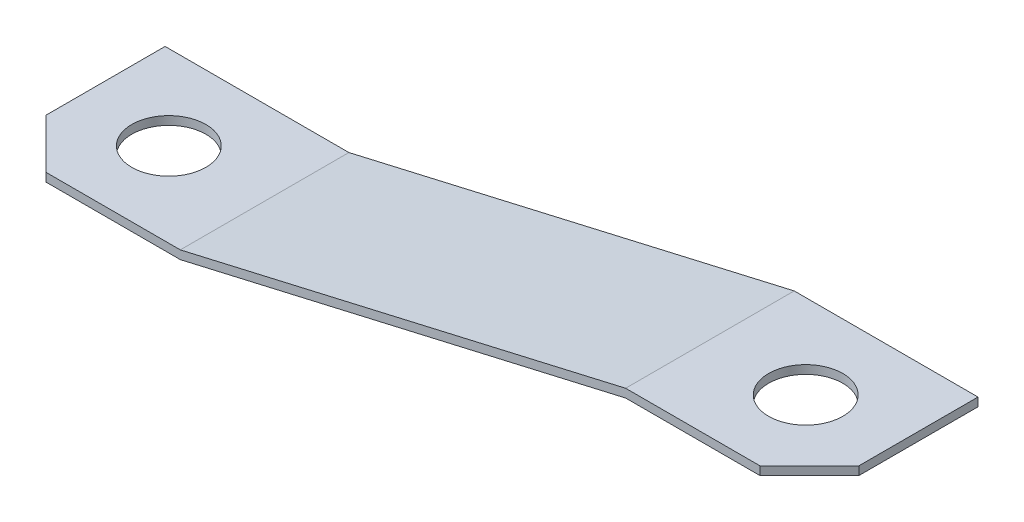
ISO-10303-21;
HEADER;
FILE_DESCRIPTION(('STEP AP214'),'2;1');
FILE_NAME('part.step','',(''),(''),'','','');
FILE_SCHEMA(('AUTOMOTIVE_DESIGN { 1 0 10303 214 1 1 1 1 }'));
ENDSEC;
DATA;
#1=APPLICATION_CONTEXT('core data for automotive mechanical design processes');
#2=APPLICATION_PROTOCOL_DEFINITION('international standard','automotive_design',2000,#1);
#3=PRODUCT_CONTEXT('',#1,'mechanical');
#4=PRODUCT('Part','Part','',(#3));
#5=PRODUCT_RELATED_PRODUCT_CATEGORY('part','',(#4));
#6=PRODUCT_DEFINITION_FORMATION('','',#4);
#7=PRODUCT_DEFINITION_CONTEXT('part definition',#1,'design');
#8=PRODUCT_DEFINITION('design','',#6,#7);
#9=PRODUCT_DEFINITION_SHAPE('','',#8);
#10=(LENGTH_UNIT() NAMED_UNIT(*) SI_UNIT(.MILLI.,.METRE.));
#11=(NAMED_UNIT(*) PLANE_ANGLE_UNIT() SI_UNIT($,.RADIAN.));
#12=(NAMED_UNIT(*) SI_UNIT($,.STERADIAN.) SOLID_ANGLE_UNIT());
#13=UNCERTAINTY_MEASURE_WITH_UNIT(LENGTH_MEASURE(1.E-05),#10,'distance_accuracy_value','');
#14=(GEOMETRIC_REPRESENTATION_CONTEXT(3) GLOBAL_UNCERTAINTY_ASSIGNED_CONTEXT((#13)) GLOBAL_UNIT_ASSIGNED_CONTEXT((#10,
#11,#12)) REPRESENTATION_CONTEXT('',''));
#15=CARTESIAN_POINT('',(0.,0.,0.));
#16=DIRECTION('',(0.,0.,1.));
#17=DIRECTION('',(1.,0.,0.));
#18=AXIS2_PLACEMENT_3D('',#15,#16,#17);
#19=CARTESIAN_POINT('',(-57.3648701182666,-1.2,23.85));
#20=DIRECTION('',(1.,0.,0.));
#21=DIRECTION('',(0.,0.,-1.));
#22=AXIS2_PLACEMENT_3D('',#19,#20,#21);
#23=PLANE('',#22);
#24=DIRECTION('',(0.,0.,-1.));
#25=VECTOR('',#24,1.);
#26=CARTESIAN_POINT('',(-57.3648701182666,-1.2,23.85));
#27=LINE('',#26,#25);
#28=CARTESIAN_POINT('',(-57.3648701182666,-1.2,16.85));
#29=VERTEX_POINT('',#28);
#30=CARTESIAN_POINT('',(-57.3648701182666,-1.2,0.));
#31=VERTEX_POINT('',#30);
#32=EDGE_CURVE('E129',#29,#31,#27,.T.);
#33=ORIENTED_EDGE('',*,*,#32,.F.);
#34=DIRECTION('',(0.,1.,0.));
#35=VECTOR('',#34,1.);
#36=CARTESIAN_POINT('',(-57.3648701182666,-1.2,16.85));
#37=LINE('',#36,#35);
#38=CARTESIAN_POINT('',(-57.3648701182666,0.,16.85));
#39=VERTEX_POINT('',#38);
#40=EDGE_CURVE('E184',#29,#39,#37,.T.);
#41=ORIENTED_EDGE('',*,*,#40,.T.);
#42=DIRECTION('',(0.,0.,-1.));
#43=VECTOR('',#42,1.);
#44=CARTESIAN_POINT('',(-57.3648701182666,0.,23.85));
#45=LINE('',#44,#43);
#46=CARTESIAN_POINT('',(-57.3648701182666,0.,0.));
#47=VERTEX_POINT('',#46);
#48=EDGE_CURVE('E146',#39,#47,#45,.T.);
#49=ORIENTED_EDGE('',*,*,#48,.T.);
#50=DIRECTION('',(0.,-1.,0.));
#51=VECTOR('',#50,1.);
#52=CARTESIAN_POINT('',(-57.3648701182666,-1.2,0.));
#53=LINE('',#52,#51);
#54=EDGE_CURVE('E147',#47,#31,#53,.T.);
#55=ORIENTED_EDGE('',*,*,#54,.T.);
#56=EDGE_LOOP('',(#33,#41,#49,#55));
#57=FACE_BOUND('',#56,.T.);
#58=ADVANCED_FACE('F33',(#57),#23,.F.);
#59=CARTESIAN_POINT('',(-31.3648701182666,-1.2,23.85));
#60=DIRECTION('',(0.,1.,0.));
#61=DIRECTION('',(-1.,0.,0.));
#62=AXIS2_PLACEMENT_3D('',#59,#60,#61);
#63=PLANE('',#62);
#64=CARTESIAN_POINT('',(-44.9148701182666,-1.2,11.925));
#65=DIRECTION('',(0.,1.,0.));
#66=DIRECTION('',(0.,0.,1.));
#67=AXIS2_PLACEMENT_3D('',#64,#65,#66);
#68=CIRCLE('',#67,5.25);
#69=CARTESIAN_POINT('',(-44.9148701182666,-1.2,17.175));
#70=VERTEX_POINT('',#69);
#71=EDGE_CURVE('E264',#70,#70,#68,.T.);
#72=ORIENTED_EDGE('',*,*,#71,.T.);
#73=EDGE_LOOP('',(#72));
#74=FACE_BOUND('',#73,.T.);
#75=DIRECTION('',(1.,0.,0.));
#76=VECTOR('',#75,1.);
#77=CARTESIAN_POINT('',(-31.3648701182666,-1.2,23.85));
#78=LINE('',#77,#76);
#79=CARTESIAN_POINT('',(-50.3648701182666,-1.2,23.85));
#80=VERTEX_POINT('',#79);
#81=CARTESIAN_POINT('',(-31.3648701182666,-1.2,23.85));
#82=VERTEX_POINT('',#81);
#83=EDGE_CURVE('E109',#80,#82,#78,.T.);
#84=ORIENTED_EDGE('',*,*,#83,.F.);
#85=DIRECTION('',(0.707106781186545,0.,0.70710678118655));
#86=VECTOR('',#85,1.);
#87=CARTESIAN_POINT('',(-50.3648701182666,-1.2,23.85));
#88=LINE('',#87,#86);
#89=EDGE_CURVE('E182',#80,#29,#88,.F.);
#90=ORIENTED_EDGE('',*,*,#89,.T.);
#91=ORIENTED_EDGE('',*,*,#32,.T.);
#92=DIRECTION('',(1.,0.,0.));
#93=VECTOR('',#92,1.);
#94=CARTESIAN_POINT('',(-31.3648701182666,-1.2,0.));
#95=LINE('',#94,#93);
#96=CARTESIAN_POINT('',(-31.3648701182666,-1.2,0.));
#97=VERTEX_POINT('',#96);
#98=EDGE_CURVE('E126',#31,#97,#95,.T.);
#99=ORIENTED_EDGE('',*,*,#98,.T.);
#100=DIRECTION('',(0.,0.,-1.));
#101=VECTOR('',#100,1.);
#102=CARTESIAN_POINT('',(-31.3648701182666,-1.2,23.85));
#103=LINE('',#102,#101);
#104=EDGE_CURVE('E123',#82,#97,#103,.T.);
#105=ORIENTED_EDGE('',*,*,#104,.F.);
#106=EDGE_LOOP('',(#84,#90,#91,#99,#105));
#107=FACE_BOUND('',#106,.T.);
#108=ADVANCED_FACE('F124',(#74,#107),#63,.F.);
#109=CARTESIAN_POINT('',(31.6351298817334,13.3446960409105,23.85));
#110=DIRECTION('',(-0.224951054343866,0.974370064785235,0.));
#111=DIRECTION('',(-0.974370064785235,-0.224951054343866,0.));
#112=AXIS2_PLACEMENT_3D('',#109,#110,#111);
#113=PLANE('',#112);
#114=DIRECTION('',(0.974370064785235,0.224951054343866,0.));
#115=VECTOR('',#114,1.);
#116=CARTESIAN_POINT('',(31.6351298817334,13.3446960409105,0.));
#117=LINE('',#116,#115);
#118=CARTESIAN_POINT('',(31.6351298817334,13.3446960409105,0.));
#119=VERTEX_POINT('',#118);
#120=EDGE_CURVE('E151',#97,#119,#117,.T.);
#121=ORIENTED_EDGE('',*,*,#120,.T.);
#122=DIRECTION('',(0.,0.,-1.));
#123=VECTOR('',#122,1.);
#124=CARTESIAN_POINT('',(31.6351298817334,13.3446960409105,23.85));
#125=LINE('',#124,#123);
#126=CARTESIAN_POINT('',(31.6351298817334,13.3446960409105,23.85));
#127=VERTEX_POINT('',#126);
#128=EDGE_CURVE('E130',#127,#119,#125,.T.);
#129=ORIENTED_EDGE('',*,*,#128,.F.);
#130=DIRECTION('',(0.974370064785235,0.224951054343866,0.));
#131=VECTOR('',#130,1.);
#132=CARTESIAN_POINT('',(31.6351298817334,13.3446960409105,23.85));
#133=LINE('',#132,#131);
#134=EDGE_CURVE('E115',#82,#127,#133,.T.);
#135=ORIENTED_EDGE('',*,*,#134,.F.);
#136=ORIENTED_EDGE('',*,*,#104,.T.);
#137=EDGE_LOOP('',(#121,#129,#135,#136));
#138=FACE_BOUND('',#137,.T.);
#139=ADVANCED_FACE('F132',(#138),#113,.F.);
#140=CARTESIAN_POINT('',(57.6351298817334,13.3446960409105,23.85));
#141=DIRECTION('',(0.,1.,0.));
#142=DIRECTION('',(-1.,0.,0.));
#143=AXIS2_PLACEMENT_3D('',#140,#141,#142);
#144=PLANE('',#143);
#145=CARTESIAN_POINT('',(45.1851298817334,13.3446960409105,11.925));
#146=DIRECTION('',(0.,1.,0.));
#147=DIRECTION('',(-1.,0.,0.));
#148=AXIS2_PLACEMENT_3D('',#145,#146,#147);
#149=CIRCLE('',#148,5.25);
#150=CARTESIAN_POINT('',(39.9351298817334,13.3446960409105,11.925));
#151=VERTEX_POINT('',#150);
#152=EDGE_CURVE('E263',#151,#151,#149,.T.);
#153=ORIENTED_EDGE('',*,*,#152,.T.);
#154=EDGE_LOOP('',(#153));
#155=FACE_BOUND('',#154,.T.);
#156=DIRECTION('',(0.,0.,-1.));
#157=VECTOR('',#156,1.);
#158=CARTESIAN_POINT('',(57.6351298817334,13.3446960409105,23.85));
#159=LINE('',#158,#157);
#160=CARTESIAN_POINT('',(57.6351298817334,13.3446960409105,16.85));
#161=VERTEX_POINT('',#160);
#162=CARTESIAN_POINT('',(57.6351298817334,13.3446960409105,0.));
#163=VERTEX_POINT('',#162);
#164=EDGE_CURVE('E174',#161,#163,#159,.T.);
#165=ORIENTED_EDGE('',*,*,#164,.F.);
#166=DIRECTION('',(0.707106781186546,0.,-0.707106781186549));
#167=VECTOR('',#166,1.);
#168=CARTESIAN_POINT('',(50.6351298817334,13.3446960409105,23.85));
#169=LINE('',#168,#167);
#170=CARTESIAN_POINT('',(50.6351298817334,13.3446960409105,23.85));
#171=VERTEX_POINT('',#170);
#172=EDGE_CURVE('E11',#161,#171,#169,.F.);
#173=ORIENTED_EDGE('',*,*,#172,.T.);
#174=DIRECTION('',(1.,0.,0.));
#175=VECTOR('',#174,1.);
#176=CARTESIAN_POINT('',(57.6351298817334,13.3446960409105,23.85));
#177=LINE('',#176,#175);
#178=EDGE_CURVE('E135',#127,#171,#177,.T.);
#179=ORIENTED_EDGE('',*,*,#178,.F.);
#180=ORIENTED_EDGE('',*,*,#128,.T.);
#181=DIRECTION('',(1.,0.,0.));
#182=VECTOR('',#181,1.);
#183=CARTESIAN_POINT('',(57.6351298817334,13.3446960409105,0.));
#184=LINE('',#183,#182);
#185=EDGE_CURVE('E153',#119,#163,#184,.T.);
#186=ORIENTED_EDGE('',*,*,#185,.T.);
#187=EDGE_LOOP('',(#165,#173,#179,#180,#186));
#188=FACE_BOUND('',#187,.T.);
#189=ADVANCED_FACE('F209',(#155,#188),#144,.F.);
#190=CARTESIAN_POINT('',(57.6351298817334,14.5446960409105,23.85));
#191=DIRECTION('',(-1.,0.,0.));
#192=DIRECTION('',(0.,-1.,0.));
#193=AXIS2_PLACEMENT_3D('',#190,#191,#192);
#194=PLANE('',#193);
#195=DIRECTION('',(0.,0.,-1.));
#196=VECTOR('',#195,1.);
#197=CARTESIAN_POINT('',(57.6351298817334,14.5446960409105,23.85));
#198=LINE('',#197,#196);
#199=CARTESIAN_POINT('',(57.6351298817334,14.5446960409105,16.85));
#200=VERTEX_POINT('',#199);
#201=CARTESIAN_POINT('',(57.6351298817334,14.5446960409105,0.));
#202=VERTEX_POINT('',#201);
#203=EDGE_CURVE('E172',#200,#202,#198,.T.);
#204=ORIENTED_EDGE('',*,*,#203,.F.);
#205=DIRECTION('',(0.,-1.,0.));
#206=VECTOR('',#205,1.);
#207=CARTESIAN_POINT('',(57.6351298817334,14.5446960409105,16.85));
#208=LINE('',#207,#206);
#209=EDGE_CURVE('E42',#200,#161,#208,.T.);
#210=ORIENTED_EDGE('',*,*,#209,.T.);
#211=ORIENTED_EDGE('',*,*,#164,.T.);
#212=DIRECTION('',(0.,1.,0.));
#213=VECTOR('',#212,1.);
#214=CARTESIAN_POINT('',(57.6351298817334,14.5446960409105,0.));
#215=LINE('',#214,#213);
#216=EDGE_CURVE('E156',#163,#202,#215,.T.);
#217=ORIENTED_EDGE('',*,*,#216,.T.);
#218=EDGE_LOOP('',(#204,#210,#211,#217));
#219=FACE_BOUND('',#218,.T.);
#220=ADVANCED_FACE('F234',(#219),#194,.F.);
#221=CARTESIAN_POINT('',(31.6351298817334,14.5446960409105,23.85));
#222=DIRECTION('',(0.,-1.,0.));
#223=DIRECTION('',(1.,0.,0.));
#224=AXIS2_PLACEMENT_3D('',#221,#222,#223);
#225=PLANE('',#224);
#226=CARTESIAN_POINT('',(45.1851298817334,14.5446960409105,11.925));
#227=DIRECTION('',(0.,1.,0.));
#228=DIRECTION('',(0.,0.,-1.));
#229=AXIS2_PLACEMENT_3D('',#226,#227,#228);
#230=CIRCLE('',#229,5.25);
#231=CARTESIAN_POINT('',(45.1851298817334,14.5446960409105,6.675));
#232=VERTEX_POINT('',#231);
#233=EDGE_CURVE('E260',#232,#232,#230,.T.);
#234=ORIENTED_EDGE('',*,*,#233,.F.);
#235=EDGE_LOOP('',(#234));
#236=FACE_BOUND('',#235,.T.);
#237=DIRECTION('',(-1.,0.,0.));
#238=VECTOR('',#237,1.);
#239=CARTESIAN_POINT('',(31.6351298817334,14.5446960409105,23.85));
#240=LINE('',#239,#238);
#241=CARTESIAN_POINT('',(50.6351298817334,14.5446960409105,23.85));
#242=VERTEX_POINT('',#241);
#243=CARTESIAN_POINT('',(31.6351298817334,14.5446960409105,23.85));
#244=VERTEX_POINT('',#243);
#245=EDGE_CURVE('E137',#242,#244,#240,.T.);
#246=ORIENTED_EDGE('',*,*,#245,.F.);
#247=DIRECTION('',(-0.707106781186546,0.,0.707106781186549));
#248=VECTOR('',#247,1.);
#249=CARTESIAN_POINT('',(50.6351298817334,14.5446960409105,23.85));
#250=LINE('',#249,#248);
#251=EDGE_CURVE('E56',#242,#200,#250,.F.);
#252=ORIENTED_EDGE('',*,*,#251,.T.);
#253=ORIENTED_EDGE('',*,*,#203,.T.);
#254=DIRECTION('',(-1.,0.,0.));
#255=VECTOR('',#254,1.);
#256=CARTESIAN_POINT('',(31.6351298817334,14.5446960409105,0.));
#257=LINE('',#256,#255);
#258=CARTESIAN_POINT('',(31.6351298817334,14.5446960409105,0.));
#259=VERTEX_POINT('',#258);
#260=EDGE_CURVE('E159',#202,#259,#257,.T.);
#261=ORIENTED_EDGE('',*,*,#260,.T.);
#262=DIRECTION('',(0.,0.,-1.));
#263=VECTOR('',#262,1.);
#264=CARTESIAN_POINT('',(31.6351298817334,14.5446960409105,23.85));
#265=LINE('',#264,#263);
#266=EDGE_CURVE('E169',#244,#259,#265,.T.);
#267=ORIENTED_EDGE('',*,*,#266,.F.);
#268=EDGE_LOOP('',(#246,#252,#253,#261,#267));
#269=FACE_BOUND('',#268,.T.);
#270=ADVANCED_FACE('F238',(#236,#269),#225,.F.);
#271=CARTESIAN_POINT('',(-31.3648701182666,0.,23.85));
#272=DIRECTION('',(0.224951054343865,-0.974370064785235,0.));
#273=DIRECTION('',(0.974370064785235,0.224951054343865,0.));
#274=AXIS2_PLACEMENT_3D('',#271,#272,#273);
#275=PLANE('',#274);
#276=DIRECTION('',(-0.974370064785235,-0.224951054343865,0.));
#277=VECTOR('',#276,1.);
#278=CARTESIAN_POINT('',(-31.3648701182666,0.,0.));
#279=LINE('',#278,#277);
#280=CARTESIAN_POINT('',(-31.3648701182666,0.,0.));
#281=VERTEX_POINT('',#280);
#282=EDGE_CURVE('E161',#259,#281,#279,.T.);
#283=ORIENTED_EDGE('',*,*,#282,.T.);
#284=DIRECTION('',(0.,0.,-1.));
#285=VECTOR('',#284,1.);
#286=CARTESIAN_POINT('',(-31.3648701182666,0.,23.85));
#287=LINE('',#286,#285);
#288=CARTESIAN_POINT('',(-31.3648701182666,0.,23.85));
#289=VERTEX_POINT('',#288);
#290=EDGE_CURVE('E166',#289,#281,#287,.T.);
#291=ORIENTED_EDGE('',*,*,#290,.F.);
#292=DIRECTION('',(-0.974370064785235,-0.224951054343865,0.));
#293=VECTOR('',#292,1.);
#294=CARTESIAN_POINT('',(-31.3648701182666,0.,23.85));
#295=LINE('',#294,#293);
#296=EDGE_CURVE('E142',#244,#289,#295,.T.);
#297=ORIENTED_EDGE('',*,*,#296,.F.);
#298=ORIENTED_EDGE('',*,*,#266,.T.);
#299=EDGE_LOOP('',(#283,#291,#297,#298));
#300=FACE_BOUND('',#299,.T.);
#301=ADVANCED_FACE('F241',(#300),#275,.F.);
#302=CARTESIAN_POINT('',(-57.3648701182666,0.,23.85));
#303=DIRECTION('',(0.,-1.,0.));
#304=DIRECTION('',(0.,0.,-1.));
#305=AXIS2_PLACEMENT_3D('',#302,#303,#304);
#306=PLANE('',#305);
#307=CARTESIAN_POINT('',(-44.9148701182666,0.,11.925));
#308=DIRECTION('',(0.,-1.,0.));
#309=DIRECTION('',(0.,0.,-1.));
#310=AXIS2_PLACEMENT_3D('',#307,#308,#309);
#311=CIRCLE('',#310,5.25);
#312=CARTESIAN_POINT('',(-44.9148701182666,0.,6.67500000000001));
#313=VERTEX_POINT('',#312);
#314=EDGE_CURVE('E37',#313,#313,#311,.T.);
#315=ORIENTED_EDGE('',*,*,#314,.T.);
#316=EDGE_LOOP('',(#315));
#317=FACE_BOUND('',#316,.T.);
#318=ORIENTED_EDGE('',*,*,#48,.F.);
#319=DIRECTION('',(-0.707106781186545,0.,-0.70710678118655));
#320=VECTOR('',#319,1.);
#321=CARTESIAN_POINT('',(-50.3648701182666,0.,23.85));
#322=LINE('',#321,#320);
#323=CARTESIAN_POINT('',(-50.3648701182666,0.,23.85));
#324=VERTEX_POINT('',#323);
#325=EDGE_CURVE('E186',#39,#324,#322,.F.);
#326=ORIENTED_EDGE('',*,*,#325,.T.);
#327=DIRECTION('',(-1.,0.,0.));
#328=VECTOR('',#327,1.);
#329=CARTESIAN_POINT('',(-57.3648701182666,0.,23.85));
#330=LINE('',#329,#328);
#331=EDGE_CURVE('E144',#289,#324,#330,.T.);
#332=ORIENTED_EDGE('',*,*,#331,.F.);
#333=ORIENTED_EDGE('',*,*,#290,.T.);
#334=DIRECTION('',(-1.,0.,0.));
#335=VECTOR('',#334,1.);
#336=CARTESIAN_POINT('',(-57.3648701182666,0.,0.));
#337=LINE('',#336,#335);
#338=EDGE_CURVE('E120',#281,#47,#337,.T.);
#339=ORIENTED_EDGE('',*,*,#338,.T.);
#340=EDGE_LOOP('',(#318,#326,#332,#333,#339));
#341=FACE_BOUND('',#340,.T.);
#342=ADVANCED_FACE('F193',(#317,#341),#306,.F.);
#343=CARTESIAN_POINT('',(0.,0.,23.85));
#344=DIRECTION('',(0.,0.,-1.));
#345=DIRECTION('',(-1.,0.,0.));
#346=AXIS2_PLACEMENT_3D('',#343,#344,#345);
#347=PLANE('',#346);
#348=ORIENTED_EDGE('',*,*,#331,.T.);
#349=DIRECTION('',(0.,-1.,0.));
#350=VECTOR('',#349,1.);
#351=CARTESIAN_POINT('',(-50.3648701182666,0.,23.85));
#352=LINE('',#351,#350);
#353=EDGE_CURVE('E118',#324,#80,#352,.T.);
#354=ORIENTED_EDGE('',*,*,#353,.T.);
#355=ORIENTED_EDGE('',*,*,#83,.T.);
#356=ORIENTED_EDGE('',*,*,#134,.T.);
#357=ORIENTED_EDGE('',*,*,#178,.T.);
#358=DIRECTION('',(0.,1.,0.));
#359=VECTOR('',#358,1.);
#360=CARTESIAN_POINT('',(50.6351298817334,-2.92793161716601E-13,23.85));
#361=LINE('',#360,#359);
#362=EDGE_CURVE('E178',#171,#242,#361,.T.);
#363=ORIENTED_EDGE('',*,*,#362,.T.);
#364=ORIENTED_EDGE('',*,*,#245,.T.);
#365=ORIENTED_EDGE('',*,*,#296,.T.);
#366=EDGE_LOOP('',(#348,#354,#355,#356,#357,#363,#364,#365));
#367=FACE_BOUND('',#366,.T.);
#368=ADVANCED_FACE('F112',(#367),#347,.F.);
#369=CARTESIAN_POINT('',(0.,0.,0.));
#370=DIRECTION('',(0.,0.,-1.));
#371=DIRECTION('',(-1.,0.,0.));
#372=AXIS2_PLACEMENT_3D('',#369,#370,#371);
#373=PLANE('',#372);
#374=ORIENTED_EDGE('',*,*,#54,.F.);
#375=ORIENTED_EDGE('',*,*,#338,.F.);
#376=ORIENTED_EDGE('',*,*,#282,.F.);
#377=ORIENTED_EDGE('',*,*,#260,.F.);
#378=ORIENTED_EDGE('',*,*,#216,.F.);
#379=ORIENTED_EDGE('',*,*,#185,.F.);
#380=ORIENTED_EDGE('',*,*,#120,.F.);
#381=ORIENTED_EDGE('',*,*,#98,.F.);
#382=EDGE_LOOP('',(#374,#375,#376,#377,#378,#379,#380,#381));
#383=FACE_BOUND('',#382,.T.);
#384=ADVANCED_FACE('F204',(#383),#373,.T.);
#385=CARTESIAN_POINT('',(-50.3648701182666,0.,23.85));
#386=DIRECTION('',(0.70710678118655,0.,-0.707106781186545));
#387=DIRECTION('',(0.,-1.,0.));
#388=AXIS2_PLACEMENT_3D('',#385,#386,#387);
#389=PLANE('',#388);
#390=ORIENTED_EDGE('',*,*,#325,.F.);
#391=ORIENTED_EDGE('',*,*,#40,.F.);
#392=ORIENTED_EDGE('',*,*,#89,.F.);
#393=ORIENTED_EDGE('',*,*,#353,.F.);
#394=EDGE_LOOP('',(#390,#391,#392,#393));
#395=FACE_BOUND('',#394,.T.);
#396=ADVANCED_FACE('F198',(#395),#389,.F.);
#397=CARTESIAN_POINT('',(50.6351298817334,-2.92793161716601E-13,23.85));
#398=DIRECTION('',(-0.707106781186549,0.,-0.707106781186546));
#399=DIRECTION('',(0.,1.,0.));
#400=AXIS2_PLACEMENT_3D('',#397,#398,#399);
#401=PLANE('',#400);
#402=ORIENTED_EDGE('',*,*,#172,.F.);
#403=ORIENTED_EDGE('',*,*,#209,.F.);
#404=ORIENTED_EDGE('',*,*,#251,.F.);
#405=ORIENTED_EDGE('',*,*,#362,.F.);
#406=EDGE_LOOP('',(#402,#403,#404,#405));
#407=FACE_BOUND('',#406,.T.);
#408=ADVANCED_FACE('F35',(#407),#401,.F.);
#409=CARTESIAN_POINT('',(-44.9148701182666,-1.2,11.925));
#410=DIRECTION('',(0.,1.,0.));
#411=DIRECTION('',(0.,0.,1.));
#412=AXIS2_PLACEMENT_3D('',#409,#410,#411);
#413=CYLINDRICAL_SURFACE('',#412,5.25);
#414=ORIENTED_EDGE('',*,*,#71,.F.);
#415=EDGE_LOOP('',(#414));
#416=FACE_BOUND('',#415,.T.);
#417=ORIENTED_EDGE('',*,*,#314,.F.);
#418=EDGE_LOOP('',(#417));
#419=FACE_BOUND('',#418,.T.);
#420=ADVANCED_FACE('F214',(#416,#419),#413,.F.);
#421=CARTESIAN_POINT('',(45.1851298817334,-1.2,11.925));
#422=DIRECTION('',(0.,1.,0.));
#423=DIRECTION('',(0.,0.,1.));
#424=AXIS2_PLACEMENT_3D('',#421,#422,#423);
#425=CYLINDRICAL_SURFACE('',#424,5.25);
#426=ORIENTED_EDGE('',*,*,#233,.T.);
#427=EDGE_LOOP('',(#426));
#428=FACE_BOUND('',#427,.T.);
#429=ORIENTED_EDGE('',*,*,#152,.F.);
#430=EDGE_LOOP('',(#429));
#431=FACE_BOUND('',#430,.T.);
#432=ADVANCED_FACE('F219',(#428,#431),#425,.F.);
#433=CLOSED_SHELL('',(#58,#108,#139,#189,#220,#270,#301,#342,#368,#384,#396,#408,#420,#432));
#434=MANIFOLD_SOLID_BREP('B2',#433);
#435=ADVANCED_BREP_SHAPE_REPRESENTATION('',(#18,#434),#14);
#436=SHAPE_DEFINITION_REPRESENTATION(#9,#435);
ENDSEC;
END-ISO-10303-21;
